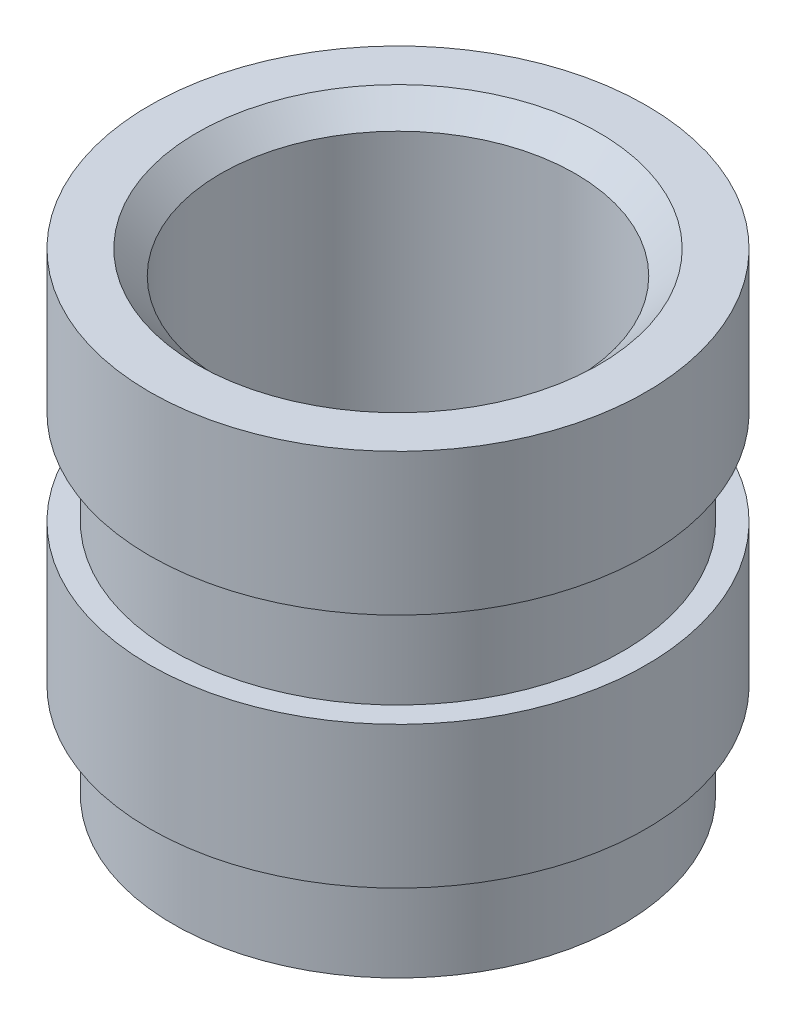
ISO-10303-21;
HEADER;
FILE_DESCRIPTION(('STEP AP214'),'2;1');
FILE_NAME('part.step','',(''),(''),'','','');
FILE_SCHEMA(('AUTOMOTIVE_DESIGN { 1 0 10303 214 1 1 1 1 }'));
ENDSEC;
DATA;
#1=APPLICATION_CONTEXT('core data for automotive mechanical design processes');
#2=APPLICATION_PROTOCOL_DEFINITION('international standard','automotive_design',2000,#1);
#3=PRODUCT_CONTEXT('',#1,'mechanical');
#4=PRODUCT('Part','Part','',(#3));
#5=PRODUCT_RELATED_PRODUCT_CATEGORY('part','',(#4));
#6=PRODUCT_DEFINITION_FORMATION('','',#4);
#7=PRODUCT_DEFINITION_CONTEXT('part definition',#1,'design');
#8=PRODUCT_DEFINITION('design','',#6,#7);
#9=PRODUCT_DEFINITION_SHAPE('','',#8);
#10=(LENGTH_UNIT() NAMED_UNIT(*) SI_UNIT(.MILLI.,.METRE.));
#11=(NAMED_UNIT(*) PLANE_ANGLE_UNIT() SI_UNIT($,.RADIAN.));
#12=(NAMED_UNIT(*) SI_UNIT($,.STERADIAN.) SOLID_ANGLE_UNIT());
#13=UNCERTAINTY_MEASURE_WITH_UNIT(LENGTH_MEASURE(1.E-05),#10,'distance_accuracy_value','');
#14=(GEOMETRIC_REPRESENTATION_CONTEXT(3) GLOBAL_UNCERTAINTY_ASSIGNED_CONTEXT((#13)) GLOBAL_UNIT_ASSIGNED_CONTEXT((#10,
#11,#12)) REPRESENTATION_CONTEXT('',''));
#15=CARTESIAN_POINT('',(0.,0.,0.));
#16=DIRECTION('',(0.,0.,1.));
#17=DIRECTION('',(1.,0.,0.));
#18=AXIS2_PLACEMENT_3D('',#15,#16,#17);
#19=CARTESIAN_POINT('',(0.,0.,0.));
#20=DIRECTION('',(0.,-1.,0.));
#21=DIRECTION('',(0.,0.,-1.));
#22=AXIS2_PLACEMENT_3D('',#19,#20,#21);
#23=CYLINDRICAL_SURFACE('',#22,1.5);
#24=CARTESIAN_POINT('',(0.,0.200000000000002,0.));
#25=DIRECTION('',(0.,-1.,0.));
#26=DIRECTION('',(0.,0.,-1.));
#27=AXIS2_PLACEMENT_3D('',#24,#25,#26);
#28=CIRCLE('',#27,1.5);
#29=CARTESIAN_POINT('',(0.,0.200000000000002,-1.5));
#30=VERTEX_POINT('',#29);
#31=EDGE_CURVE('E44',#30,#30,#28,.T.);
#32=ORIENTED_EDGE('',*,*,#31,.T.);
#33=EDGE_LOOP('',(#32));
#34=FACE_BOUND('',#33,.T.);
#35=CARTESIAN_POINT('',(0.,3.8,0.));
#36=DIRECTION('',(0.,1.,0.));
#37=DIRECTION('',(0.,0.,1.));
#38=AXIS2_PLACEMENT_3D('',#35,#36,#37);
#39=CIRCLE('',#38,1.5);
#40=CARTESIAN_POINT('',(0.,3.8,1.5));
#41=VERTEX_POINT('',#40);
#42=EDGE_CURVE('E48',#41,#41,#39,.T.);
#43=ORIENTED_EDGE('',*,*,#42,.T.);
#44=EDGE_LOOP('',(#43));
#45=FACE_BOUND('',#44,.T.);
#46=ADVANCED_FACE('F33',(#34,#45),#23,.F.);
#47=CARTESIAN_POINT('',(1.5,4.,0.));
#48=DIRECTION('',(0.,1.,0.));
#49=DIRECTION('',(0.,0.,1.));
#50=AXIS2_PLACEMENT_3D('',#47,#48,#49);
#51=PLANE('',#50);
#52=CARTESIAN_POINT('',(0.,4.,0.));
#53=DIRECTION('',(0.,1.,0.));
#54=DIRECTION('',(0.,0.,1.));
#55=AXIS2_PLACEMENT_3D('',#52,#53,#54);
#56=CIRCLE('',#55,1.7);
#57=CARTESIAN_POINT('',(0.,4.,1.7));
#58=VERTEX_POINT('',#57);
#59=EDGE_CURVE('E10',#58,#58,#56,.F.);
#60=ORIENTED_EDGE('',*,*,#59,.T.);
#61=EDGE_LOOP('',(#60));
#62=FACE_BOUND('',#61,.T.);
#63=CARTESIAN_POINT('',(0.,4.,0.));
#64=DIRECTION('',(0.,-1.,0.));
#65=DIRECTION('',(0.,0.,-1.));
#66=AXIS2_PLACEMENT_3D('',#63,#64,#65);
#67=CIRCLE('',#66,2.1);
#68=CARTESIAN_POINT('',(0.,4.,-2.1));
#69=VERTEX_POINT('',#68);
#70=EDGE_CURVE('E53',#69,#69,#67,.T.);
#71=ORIENTED_EDGE('',*,*,#70,.F.);
#72=EDGE_LOOP('',(#71));
#73=FACE_BOUND('',#72,.T.);
#74=ADVANCED_FACE('F95',(#62,#73),#51,.T.);
#75=CARTESIAN_POINT('',(0.,0.,0.));
#76=DIRECTION('',(0.,-1.,0.));
#77=DIRECTION('',(0.,0.,-1.));
#78=AXIS2_PLACEMENT_3D('',#75,#76,#77);
#79=CYLINDRICAL_SURFACE('',#78,2.1);
#80=ORIENTED_EDGE('',*,*,#70,.T.);
#81=EDGE_LOOP('',(#80));
#82=FACE_BOUND('',#81,.T.);
#83=CARTESIAN_POINT('',(0.,2.8,0.));
#84=DIRECTION('',(0.,-1.,0.));
#85=DIRECTION('',(0.,0.,-1.));
#86=AXIS2_PLACEMENT_3D('',#83,#84,#85);
#87=CIRCLE('',#86,2.1);
#88=CARTESIAN_POINT('',(0.,2.8,-2.1));
#89=VERTEX_POINT('',#88);
#90=EDGE_CURVE('E56',#89,#89,#87,.T.);
#91=ORIENTED_EDGE('',*,*,#90,.F.);
#92=EDGE_LOOP('',(#91));
#93=FACE_BOUND('',#92,.T.);
#94=ADVANCED_FACE('F101',(#82,#93),#79,.T.);
#95=CARTESIAN_POINT('',(2.1,2.8,0.));
#96=DIRECTION('',(0.,-1.,0.));
#97=DIRECTION('',(0.,0.,-1.));
#98=AXIS2_PLACEMENT_3D('',#95,#96,#97);
#99=PLANE('',#98);
#100=ORIENTED_EDGE('',*,*,#90,.T.);
#101=EDGE_LOOP('',(#100));
#102=FACE_BOUND('',#101,.T.);
#103=CARTESIAN_POINT('',(0.,2.8,0.));
#104=DIRECTION('',(0.,-1.,0.));
#105=DIRECTION('',(0.,0.,-1.));
#106=AXIS2_PLACEMENT_3D('',#103,#104,#105);
#107=CIRCLE('',#106,1.9);
#108=CARTESIAN_POINT('',(0.,2.8,-1.9));
#109=VERTEX_POINT('',#108);
#110=EDGE_CURVE('E59',#109,#109,#107,.T.);
#111=ORIENTED_EDGE('',*,*,#110,.F.);
#112=EDGE_LOOP('',(#111));
#113=FACE_BOUND('',#112,.T.);
#114=ADVANCED_FACE('F178',(#102,#113),#99,.T.);
#115=CARTESIAN_POINT('',(0.,0.,0.));
#116=DIRECTION('',(0.,-1.,0.));
#117=DIRECTION('',(0.,0.,-1.));
#118=AXIS2_PLACEMENT_3D('',#115,#116,#117);
#119=CYLINDRICAL_SURFACE('',#118,1.9);
#120=ORIENTED_EDGE('',*,*,#110,.T.);
#121=EDGE_LOOP('',(#120));
#122=FACE_BOUND('',#121,.T.);
#123=CARTESIAN_POINT('',(0.,2.,0.));
#124=DIRECTION('',(0.,-1.,0.));
#125=DIRECTION('',(0.,0.,-1.));
#126=AXIS2_PLACEMENT_3D('',#123,#124,#125);
#127=CIRCLE('',#126,1.9);
#128=CARTESIAN_POINT('',(0.,2.,-1.9));
#129=VERTEX_POINT('',#128);
#130=EDGE_CURVE('E62',#129,#129,#127,.T.);
#131=ORIENTED_EDGE('',*,*,#130,.F.);
#132=EDGE_LOOP('',(#131));
#133=FACE_BOUND('',#132,.T.);
#134=ADVANCED_FACE('F168',(#122,#133),#119,.T.);
#135=CARTESIAN_POINT('',(1.9,2.,0.));
#136=DIRECTION('',(0.,1.,0.));
#137=DIRECTION('',(0.,0.,1.));
#138=AXIS2_PLACEMENT_3D('',#135,#136,#137);
#139=PLANE('',#138);
#140=ORIENTED_EDGE('',*,*,#130,.T.);
#141=EDGE_LOOP('',(#140));
#142=FACE_BOUND('',#141,.T.);
#143=CARTESIAN_POINT('',(0.,2.,0.));
#144=DIRECTION('',(0.,-1.,0.));
#145=DIRECTION('',(0.,0.,-1.));
#146=AXIS2_PLACEMENT_3D('',#143,#144,#145);
#147=CIRCLE('',#146,2.1);
#148=CARTESIAN_POINT('',(0.,2.,-2.1));
#149=VERTEX_POINT('',#148);
#150=EDGE_CURVE('E65',#149,#149,#147,.T.);
#151=ORIENTED_EDGE('',*,*,#150,.F.);
#152=EDGE_LOOP('',(#151));
#153=FACE_BOUND('',#152,.T.);
#154=ADVANCED_FACE('F158',(#142,#153),#139,.T.);
#155=CARTESIAN_POINT('',(0.,0.,0.));
#156=DIRECTION('',(0.,-1.,0.));
#157=DIRECTION('',(0.,0.,-1.));
#158=AXIS2_PLACEMENT_3D('',#155,#156,#157);
#159=CYLINDRICAL_SURFACE('',#158,2.1);
#160=ORIENTED_EDGE('',*,*,#150,.T.);
#161=EDGE_LOOP('',(#160));
#162=FACE_BOUND('',#161,.T.);
#163=CARTESIAN_POINT('',(0.,0.800000000000001,0.));
#164=DIRECTION('',(0.,-1.,0.));
#165=DIRECTION('',(0.,0.,-1.));
#166=AXIS2_PLACEMENT_3D('',#163,#164,#165);
#167=CIRCLE('',#166,2.1);
#168=CARTESIAN_POINT('',(0.,0.800000000000001,-2.1));
#169=VERTEX_POINT('',#168);
#170=EDGE_CURVE('E68',#169,#169,#167,.T.);
#171=ORIENTED_EDGE('',*,*,#170,.F.);
#172=EDGE_LOOP('',(#171));
#173=FACE_BOUND('',#172,.T.);
#174=ADVANCED_FACE('F91',(#162,#173),#159,.T.);
#175=CARTESIAN_POINT('',(2.1,0.800000000000001,0.));
#176=DIRECTION('',(0.,-1.,0.));
#177=DIRECTION('',(0.,0.,-1.));
#178=AXIS2_PLACEMENT_3D('',#175,#176,#177);
#179=PLANE('',#178);
#180=ORIENTED_EDGE('',*,*,#170,.T.);
#181=EDGE_LOOP('',(#180));
#182=FACE_BOUND('',#181,.T.);
#183=CARTESIAN_POINT('',(0.,0.800000000000001,0.));
#184=DIRECTION('',(0.,-1.,0.));
#185=DIRECTION('',(0.,0.,-1.));
#186=AXIS2_PLACEMENT_3D('',#183,#184,#185);
#187=CIRCLE('',#186,1.9);
#188=CARTESIAN_POINT('',(0.,0.800000000000001,-1.9));
#189=VERTEX_POINT('',#188);
#190=EDGE_CURVE('E71',#189,#189,#187,.T.);
#191=ORIENTED_EDGE('',*,*,#190,.F.);
#192=EDGE_LOOP('',(#191));
#193=FACE_BOUND('',#192,.T.);
#194=ADVANCED_FACE('F82',(#182,#193),#179,.T.);
#195=CARTESIAN_POINT('',(0.,0.,0.));
#196=DIRECTION('',(0.,-1.,0.));
#197=DIRECTION('',(0.,0.,-1.));
#198=AXIS2_PLACEMENT_3D('',#195,#196,#197);
#199=CYLINDRICAL_SURFACE('',#198,1.9);
#200=ORIENTED_EDGE('',*,*,#190,.T.);
#201=EDGE_LOOP('',(#200));
#202=FACE_BOUND('',#201,.T.);
#203=CARTESIAN_POINT('',(0.,0.,0.));
#204=DIRECTION('',(0.,-1.,0.));
#205=DIRECTION('',(0.,0.,-1.));
#206=AXIS2_PLACEMENT_3D('',#203,#204,#205);
#207=CIRCLE('',#206,1.9);
#208=CARTESIAN_POINT('',(0.,0.,-1.9));
#209=VERTEX_POINT('',#208);
#210=EDGE_CURVE('E74',#209,#209,#207,.T.);
#211=ORIENTED_EDGE('',*,*,#210,.F.);
#212=EDGE_LOOP('',(#211));
#213=FACE_BOUND('',#212,.T.);
#214=ADVANCED_FACE('F80',(#202,#213),#199,.T.);
#215=CARTESIAN_POINT('',(1.9,0.,0.));
#216=DIRECTION('',(0.,-1.,0.));
#217=DIRECTION('',(0.,0.,-1.));
#218=AXIS2_PLACEMENT_3D('',#215,#216,#217);
#219=PLANE('',#218);
#220=CARTESIAN_POINT('',(0.,0.,0.));
#221=DIRECTION('',(0.,-1.,0.));
#222=DIRECTION('',(0.,0.,-1.));
#223=AXIS2_PLACEMENT_3D('',#220,#221,#222);
#224=CIRCLE('',#223,1.7);
#225=CARTESIAN_POINT('',(0.,0.,-1.7));
#226=VERTEX_POINT('',#225);
#227=EDGE_CURVE('E40',#226,#226,#224,.F.);
#228=ORIENTED_EDGE('',*,*,#227,.T.);
#229=EDGE_LOOP('',(#228));
#230=FACE_BOUND('',#229,.T.);
#231=ORIENTED_EDGE('',*,*,#210,.T.);
#232=EDGE_LOOP('',(#231));
#233=FACE_BOUND('',#232,.T.);
#234=ADVANCED_FACE('F78',(#230,#233),#219,.T.);
#235=CARTESIAN_POINT('',(0.,0.200000000000002,0.));
#236=DIRECTION('',(0.,-1.,0.));
#237=DIRECTION('',(0.,0.,-1.));
#238=AXIS2_PLACEMENT_3D('',#235,#236,#237);
#239=CONICAL_SURFACE('',#238,1.5,0.785398163397451);
#240=ORIENTED_EDGE('',*,*,#227,.F.);
#241=EDGE_LOOP('',(#240));
#242=FACE_BOUND('',#241,.T.);
#243=ORIENTED_EDGE('',*,*,#31,.F.);
#244=EDGE_LOOP('',(#243));
#245=FACE_BOUND('',#244,.T.);
#246=ADVANCED_FACE('F89',(#242,#245),#239,.F.);
#247=CARTESIAN_POINT('',(0.,4.,0.));
#248=DIRECTION('',(0.,1.,0.));
#249=DIRECTION('',(0.,0.,1.));
#250=AXIS2_PLACEMENT_3D('',#247,#248,#249);
#251=CONICAL_SURFACE('',#250,1.7,0.785398163397446);
#252=ORIENTED_EDGE('',*,*,#42,.F.);
#253=EDGE_LOOP('',(#252));
#254=FACE_BOUND('',#253,.T.);
#255=ORIENTED_EDGE('',*,*,#59,.F.);
#256=EDGE_LOOP('',(#255));
#257=FACE_BOUND('',#256,.T.);
#258=ADVANCED_FACE('F35',(#254,#257),#251,.F.);
#259=CLOSED_SHELL('',(#46,#74,#94,#114,#134,#154,#174,#194,#214,#234,#246,#258));
#260=MANIFOLD_SOLID_BREP('B2',#259);
#261=ADVANCED_BREP_SHAPE_REPRESENTATION('',(#18,#260),#14);
#262=SHAPE_DEFINITION_REPRESENTATION(#9,#261);
ENDSEC;
END-ISO-10303-21;
